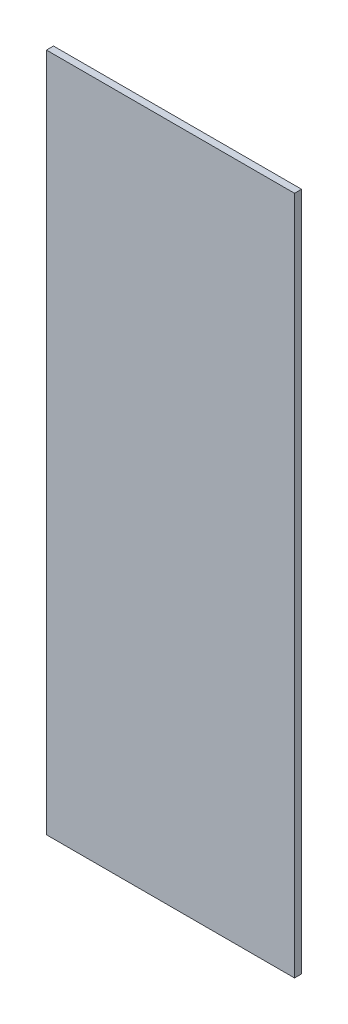
ISO-10303-21;
HEADER;
FILE_DESCRIPTION(('STEP AP214'),'2;1');
FILE_NAME('part.step','',(''),(''),'','','');
FILE_SCHEMA(('AUTOMOTIVE_DESIGN { 1 0 10303 214 1 1 1 1 }'));
ENDSEC;
DATA;
#1=APPLICATION_CONTEXT('core data for automotive mechanical design processes');
#2=APPLICATION_PROTOCOL_DEFINITION('international standard','automotive_design',2000,#1);
#3=PRODUCT_CONTEXT('',#1,'mechanical');
#4=PRODUCT('Part','Part','',(#3));
#5=PRODUCT_RELATED_PRODUCT_CATEGORY('part','',(#4));
#6=PRODUCT_DEFINITION_FORMATION('','',#4);
#7=PRODUCT_DEFINITION_CONTEXT('part definition',#1,'design');
#8=PRODUCT_DEFINITION('design','',#6,#7);
#9=PRODUCT_DEFINITION_SHAPE('','',#8);
#10=(LENGTH_UNIT() NAMED_UNIT(*) SI_UNIT(.MILLI.,.METRE.));
#11=(NAMED_UNIT(*) PLANE_ANGLE_UNIT() SI_UNIT($,.RADIAN.));
#12=(NAMED_UNIT(*) SI_UNIT($,.STERADIAN.) SOLID_ANGLE_UNIT());
#13=UNCERTAINTY_MEASURE_WITH_UNIT(LENGTH_MEASURE(1.E-05),#10,'distance_accuracy_value','');
#14=(GEOMETRIC_REPRESENTATION_CONTEXT(3) GLOBAL_UNCERTAINTY_ASSIGNED_CONTEXT((#13)) GLOBAL_UNIT_ASSIGNED_CONTEXT((#10,
#11,#12)) REPRESENTATION_CONTEXT('',''));
#15=CARTESIAN_POINT('',(0.,0.,0.));
#16=DIRECTION('',(0.,0.,1.));
#17=DIRECTION('',(1.,0.,0.));
#18=AXIS2_PLACEMENT_3D('',#15,#16,#17);
#19=CARTESIAN_POINT('',(-209.7991532176,587.220249420893,25.4));
#20=DIRECTION('',(1.,0.,0.));
#21=DIRECTION('',(0.,0.,-1.));
#22=AXIS2_PLACEMENT_3D('',#19,#20,#21);
#23=PLANE('',#22);
#24=DIRECTION('',(0.,-1.,0.));
#25=VECTOR('',#24,1.);
#26=CARTESIAN_POINT('',(-209.7991532176,587.220249420893,0.));
#27=LINE('',#26,#25);
#28=CARTESIAN_POINT('',(-209.7991532176,3046.0665134761,0.));
#29=VERTEX_POINT('',#28);
#30=CARTESIAN_POINT('',(-209.7991532176,587.220249420893,0.));
#31=VERTEX_POINT('',#30);
#32=EDGE_CURVE('E96',#29,#31,#27,.T.);
#33=ORIENTED_EDGE('',*,*,#32,.T.);
#34=DIRECTION('',(0.,0.,-1.));
#35=VECTOR('',#34,1.);
#36=CARTESIAN_POINT('',(-209.7991532176,587.220249420893,25.4));
#37=LINE('',#36,#35);
#38=CARTESIAN_POINT('',(-209.7991532176,587.220249420893,25.4));
#39=VERTEX_POINT('',#38);
#40=EDGE_CURVE('E11',#39,#31,#37,.T.);
#41=ORIENTED_EDGE('',*,*,#40,.F.);
#42=DIRECTION('',(0.,-1.,0.));
#43=VECTOR('',#42,1.);
#44=CARTESIAN_POINT('',(-209.7991532176,587.220249420893,25.4));
#45=LINE('',#44,#43);
#46=CARTESIAN_POINT('',(-209.7991532176,3046.0665134761,25.4));
#47=VERTEX_POINT('',#46);
#48=EDGE_CURVE('E84',#47,#39,#45,.T.);
#49=ORIENTED_EDGE('',*,*,#48,.F.);
#50=DIRECTION('',(0.,0.,-1.));
#51=VECTOR('',#50,1.);
#52=CARTESIAN_POINT('',(-209.7991532176,3046.0665134761,25.4));
#53=LINE('',#52,#51);
#54=EDGE_CURVE('E92',#47,#29,#53,.T.);
#55=ORIENTED_EDGE('',*,*,#54,.T.);
#56=EDGE_LOOP('',(#33,#41,#49,#55));
#57=FACE_BOUND('',#56,.T.);
#58=ADVANCED_FACE('F33',(#57),#23,.F.);
#59=CARTESIAN_POINT('',(-209.7991532176,587.220249420893,25.4));
#60=DIRECTION('',(0.,1.,0.));
#61=DIRECTION('',(0.,0.,1.));
#62=AXIS2_PLACEMENT_3D('',#59,#60,#61);
#63=PLANE('',#62);
#64=DIRECTION('',(1.,0.,0.));
#65=VECTOR('',#64,1.);
#66=CARTESIAN_POINT('',(-209.7991532176,587.220249420893,0.));
#67=LINE('',#66,#65);
#68=CARTESIAN_POINT('',(687.678851751396,587.220249420893,0.));
#69=VERTEX_POINT('',#68);
#70=EDGE_CURVE('E88',#31,#69,#67,.T.);
#71=ORIENTED_EDGE('',*,*,#70,.T.);
#72=DIRECTION('',(0.,0.,-1.));
#73=VECTOR('',#72,1.);
#74=CARTESIAN_POINT('',(687.678851751396,587.220249420893,25.4));
#75=LINE('',#74,#73);
#76=CARTESIAN_POINT('',(687.678851751396,587.220249420893,25.4));
#77=VERTEX_POINT('',#76);
#78=EDGE_CURVE('E41',#77,#69,#75,.T.);
#79=ORIENTED_EDGE('',*,*,#78,.F.);
#80=DIRECTION('',(1.,0.,0.));
#81=VECTOR('',#80,1.);
#82=CARTESIAN_POINT('',(-209.7991532176,587.220249420893,25.4));
#83=LINE('',#82,#81);
#84=EDGE_CURVE('E79',#39,#77,#83,.T.);
#85=ORIENTED_EDGE('',*,*,#84,.F.);
#86=ORIENTED_EDGE('',*,*,#40,.T.);
#87=EDGE_LOOP('',(#71,#79,#85,#86));
#88=FACE_BOUND('',#87,.T.);
#89=ADVANCED_FACE('F87',(#88),#63,.F.);
#90=CARTESIAN_POINT('',(687.678851751396,587.220249420893,25.4));
#91=DIRECTION('',(-1.,0.,0.));
#92=DIRECTION('',(0.,0.,1.));
#93=AXIS2_PLACEMENT_3D('',#90,#91,#92);
#94=PLANE('',#93);
#95=DIRECTION('',(0.,1.,0.));
#96=VECTOR('',#95,1.);
#97=CARTESIAN_POINT('',(687.678851751396,587.220249420893,0.));
#98=LINE('',#97,#96);
#99=CARTESIAN_POINT('',(687.678851751396,3046.0665134761,0.));
#100=VERTEX_POINT('',#99);
#101=EDGE_CURVE('E66',#69,#100,#98,.T.);
#102=ORIENTED_EDGE('',*,*,#101,.T.);
#103=DIRECTION('',(0.,0.,-1.));
#104=VECTOR('',#103,1.);
#105=CARTESIAN_POINT('',(687.678851751396,3046.0665134761,25.4));
#106=LINE('',#105,#104);
#107=CARTESIAN_POINT('',(687.678851751396,3046.0665134761,25.4));
#108=VERTEX_POINT('',#107);
#109=EDGE_CURVE('E89',#108,#100,#106,.T.);
#110=ORIENTED_EDGE('',*,*,#109,.F.);
#111=DIRECTION('',(0.,1.,0.));
#112=VECTOR('',#111,1.);
#113=CARTESIAN_POINT('',(687.678851751396,587.220249420893,25.4));
#114=LINE('',#113,#112);
#115=EDGE_CURVE('E82',#77,#108,#114,.T.);
#116=ORIENTED_EDGE('',*,*,#115,.F.);
#117=ORIENTED_EDGE('',*,*,#78,.T.);
#118=EDGE_LOOP('',(#102,#110,#116,#117));
#119=FACE_BOUND('',#118,.T.);
#120=ADVANCED_FACE('F90',(#119),#94,.F.);
#121=CARTESIAN_POINT('',(-209.7991532176,3046.0665134761,25.4));
#122=DIRECTION('',(0.,-1.,0.));
#123=DIRECTION('',(0.,0.,-1.));
#124=AXIS2_PLACEMENT_3D('',#121,#122,#123);
#125=PLANE('',#124);
#126=DIRECTION('',(-1.,0.,0.));
#127=VECTOR('',#126,1.);
#128=CARTESIAN_POINT('',(-209.7991532176,3046.0665134761,0.));
#129=LINE('',#128,#127);
#130=EDGE_CURVE('E72',#100,#29,#129,.T.);
#131=ORIENTED_EDGE('',*,*,#130,.T.);
#132=ORIENTED_EDGE('',*,*,#54,.F.);
#133=DIRECTION('',(-1.,0.,0.));
#134=VECTOR('',#133,1.);
#135=CARTESIAN_POINT('',(-209.7991532176,3046.0665134761,25.4));
#136=LINE('',#135,#134);
#137=EDGE_CURVE('E49',#108,#47,#136,.T.);
#138=ORIENTED_EDGE('',*,*,#137,.F.);
#139=ORIENTED_EDGE('',*,*,#109,.T.);
#140=EDGE_LOOP('',(#131,#132,#138,#139));
#141=FACE_BOUND('',#140,.T.);
#142=ADVANCED_FACE('F103',(#141),#125,.F.);
#143=CARTESIAN_POINT('',(0.,0.,25.4));
#144=DIRECTION('',(0.,0.,-1.));
#145=DIRECTION('',(-1.,0.,0.));
#146=AXIS2_PLACEMENT_3D('',#143,#144,#145);
#147=PLANE('',#146);
#148=ORIENTED_EDGE('',*,*,#48,.T.);
#149=ORIENTED_EDGE('',*,*,#84,.T.);
#150=ORIENTED_EDGE('',*,*,#115,.T.);
#151=ORIENTED_EDGE('',*,*,#137,.T.);
#152=EDGE_LOOP('',(#148,#149,#150,#151));
#153=FACE_BOUND('',#152,.T.);
#154=ADVANCED_FACE('F80',(#153),#147,.F.);
#155=CARTESIAN_POINT('',(0.,0.,0.));
#156=DIRECTION('',(0.,0.,-1.));
#157=DIRECTION('',(-1.,0.,0.));
#158=AXIS2_PLACEMENT_3D('',#155,#156,#157);
#159=PLANE('',#158);
#160=ORIENTED_EDGE('',*,*,#32,.F.);
#161=ORIENTED_EDGE('',*,*,#130,.F.);
#162=ORIENTED_EDGE('',*,*,#101,.F.);
#163=ORIENTED_EDGE('',*,*,#70,.F.);
#164=EDGE_LOOP('',(#160,#161,#162,#163));
#165=FACE_BOUND('',#164,.T.);
#166=ADVANCED_FACE('F106',(#165),#159,.T.);
#167=CLOSED_SHELL('',(#58,#89,#120,#142,#154,#166));
#168=MANIFOLD_SOLID_BREP('B2',#167);
#169=ADVANCED_BREP_SHAPE_REPRESENTATION('',(#18,#168),#14);
#170=SHAPE_DEFINITION_REPRESENTATION(#9,#169);
ENDSEC;
END-ISO-10303-21;
